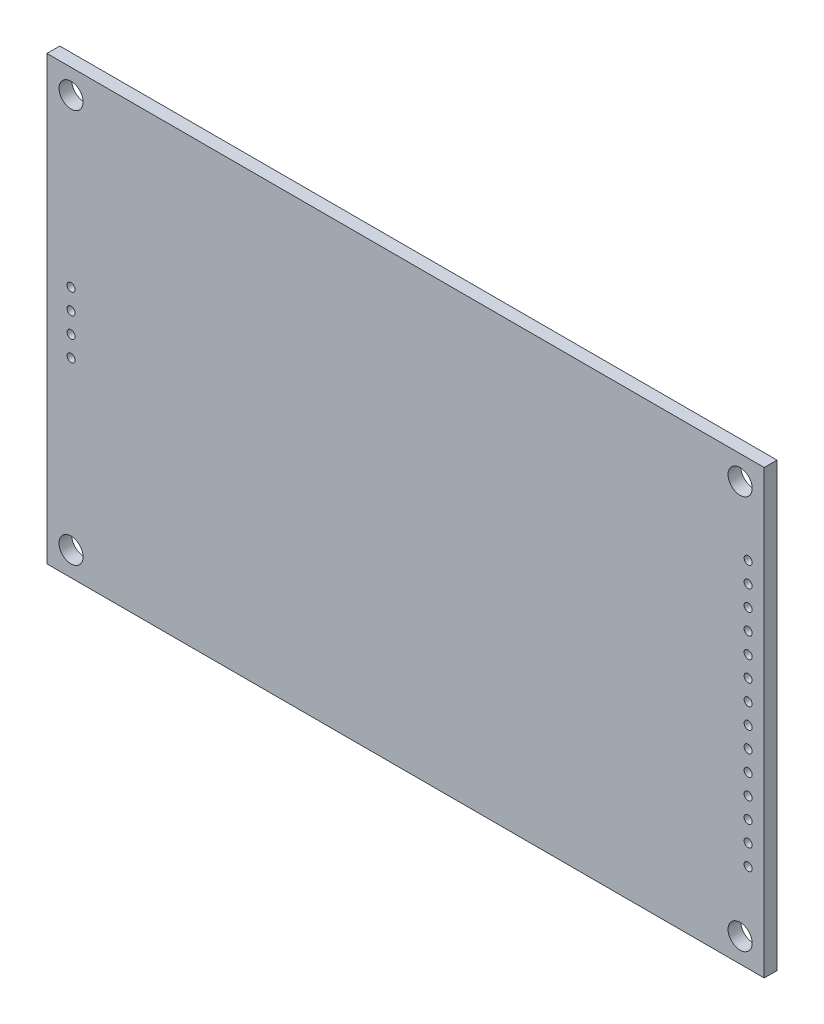
ISO-10303-21;
HEADER;
FILE_DESCRIPTION(('STEP AP214'),'2;1');
FILE_NAME('part.step','',(''),(''),'','','');
FILE_SCHEMA(('AUTOMOTIVE_DESIGN { 1 0 10303 214 1 1 1 1 }'));
ENDSEC;
DATA;
#1=APPLICATION_CONTEXT('core data for automotive mechanical design processes');
#2=APPLICATION_PROTOCOL_DEFINITION('international standard','automotive_design',2000,#1);
#3=PRODUCT_CONTEXT('',#1,'mechanical');
#4=PRODUCT('Part','Part','',(#3));
#5=PRODUCT_RELATED_PRODUCT_CATEGORY('part','',(#4));
#6=PRODUCT_DEFINITION_FORMATION('','',#4);
#7=PRODUCT_DEFINITION_CONTEXT('part definition',#1,'design');
#8=PRODUCT_DEFINITION('design','',#6,#7);
#9=PRODUCT_DEFINITION_SHAPE('','',#8);
#10=(LENGTH_UNIT() NAMED_UNIT(*) SI_UNIT(.MILLI.,.METRE.));
#11=(NAMED_UNIT(*) PLANE_ANGLE_UNIT() SI_UNIT($,.RADIAN.));
#12=(NAMED_UNIT(*) SI_UNIT($,.STERADIAN.) SOLID_ANGLE_UNIT());
#13=UNCERTAINTY_MEASURE_WITH_UNIT(LENGTH_MEASURE(1.E-05),#10,'distance_accuracy_value','');
#14=(GEOMETRIC_REPRESENTATION_CONTEXT(3) GLOBAL_UNCERTAINTY_ASSIGNED_CONTEXT((#13)) GLOBAL_UNIT_ASSIGNED_CONTEXT((#10,
#11,#12)) REPRESENTATION_CONTEXT('',''));
#15=CARTESIAN_POINT('',(0.,0.,0.));
#16=DIRECTION('',(0.,0.,1.));
#17=DIRECTION('',(1.,0.,0.));
#18=AXIS2_PLACEMENT_3D('',#15,#16,#17);
#19=CARTESIAN_POINT('',(-44.3,28.04,1.6));
#20=DIRECTION('',(1.,0.,0.));
#21=DIRECTION('',(0.,1.,0.));
#22=AXIS2_PLACEMENT_3D('',#19,#20,#21);
#23=PLANE('',#22);
#24=DIRECTION('',(0.,-1.,0.));
#25=VECTOR('',#24,1.);
#26=CARTESIAN_POINT('',(-44.3,28.04,0.));
#27=LINE('',#26,#25);
#28=CARTESIAN_POINT('',(-44.3,28.04,0.));
#29=VERTEX_POINT('',#28);
#30=CARTESIAN_POINT('',(-44.3,-27.,0.));
#31=VERTEX_POINT('',#30);
#32=EDGE_CURVE('E111',#29,#31,#27,.T.);
#33=ORIENTED_EDGE('',*,*,#32,.T.);
#34=DIRECTION('',(0.,0.,-1.));
#35=VECTOR('',#34,1.);
#36=CARTESIAN_POINT('',(-44.3,-27.,1.6));
#37=LINE('',#36,#35);
#38=CARTESIAN_POINT('',(-44.3,-27.,1.6));
#39=VERTEX_POINT('',#38);
#40=EDGE_CURVE('E11',#39,#31,#37,.T.);
#41=ORIENTED_EDGE('',*,*,#40,.F.);
#42=DIRECTION('',(0.,-1.,0.));
#43=VECTOR('',#42,1.);
#44=CARTESIAN_POINT('',(-44.3,28.04,1.6));
#45=LINE('',#44,#43);
#46=CARTESIAN_POINT('',(-44.3,28.04,1.6));
#47=VERTEX_POINT('',#46);
#48=EDGE_CURVE('E95',#47,#39,#45,.T.);
#49=ORIENTED_EDGE('',*,*,#48,.F.);
#50=DIRECTION('',(0.,0.,-1.));
#51=VECTOR('',#50,1.);
#52=CARTESIAN_POINT('',(-44.3,28.04,1.6));
#53=LINE('',#52,#51);
#54=EDGE_CURVE('E107',#47,#29,#53,.T.);
#55=ORIENTED_EDGE('',*,*,#54,.T.);
#56=EDGE_LOOP('',(#33,#41,#49,#55));
#57=FACE_BOUND('',#56,.T.);
#58=ADVANCED_FACE('F43',(#57),#23,.F.);
#59=CARTESIAN_POINT('',(-44.3,-27.,1.6));
#60=DIRECTION('',(0.,1.,0.));
#61=DIRECTION('',(0.,0.,1.));
#62=AXIS2_PLACEMENT_3D('',#59,#60,#61);
#63=PLANE('',#62);
#64=DIRECTION('',(1.,0.,0.));
#65=VECTOR('',#64,1.);
#66=CARTESIAN_POINT('',(-44.3,-27.,0.));
#67=LINE('',#66,#65);
#68=CARTESIAN_POINT('',(45.,-27.,0.));
#69=VERTEX_POINT('',#68);
#70=EDGE_CURVE('E100',#31,#69,#67,.T.);
#71=ORIENTED_EDGE('',*,*,#70,.T.);
#72=DIRECTION('',(0.,0.,-1.));
#73=VECTOR('',#72,1.);
#74=CARTESIAN_POINT('',(45.,-27.,1.6));
#75=LINE('',#74,#73);
#76=CARTESIAN_POINT('',(45.,-27.,1.6));
#77=VERTEX_POINT('',#76);
#78=EDGE_CURVE('E52',#77,#69,#75,.T.);
#79=ORIENTED_EDGE('',*,*,#78,.F.);
#80=DIRECTION('',(1.,0.,0.));
#81=VECTOR('',#80,1.);
#82=CARTESIAN_POINT('',(-44.3,-27.,1.6));
#83=LINE('',#82,#81);
#84=EDGE_CURVE('E90',#39,#77,#83,.T.);
#85=ORIENTED_EDGE('',*,*,#84,.F.);
#86=ORIENTED_EDGE('',*,*,#40,.T.);
#87=EDGE_LOOP('',(#71,#79,#85,#86));
#88=FACE_BOUND('',#87,.T.);
#89=ADVANCED_FACE('F99',(#88),#63,.F.);
#90=CARTESIAN_POINT('',(45.,28.04,1.6));
#91=DIRECTION('',(-1.,0.,0.));
#92=DIRECTION('',(0.,0.,1.));
#93=AXIS2_PLACEMENT_3D('',#90,#91,#92);
#94=PLANE('',#93);
#95=DIRECTION('',(0.,1.,0.));
#96=VECTOR('',#95,1.);
#97=CARTESIAN_POINT('',(45.,28.04,0.));
#98=LINE('',#97,#96);
#99=CARTESIAN_POINT('',(45.,28.04,0.));
#100=VERTEX_POINT('',#99);
#101=EDGE_CURVE('E77',#69,#100,#98,.T.);
#102=ORIENTED_EDGE('',*,*,#101,.T.);
#103=DIRECTION('',(0.,0.,-1.));
#104=VECTOR('',#103,1.);
#105=CARTESIAN_POINT('',(45.,28.04,1.6));
#106=LINE('',#105,#104);
#107=CARTESIAN_POINT('',(45.,28.04,1.6));
#108=VERTEX_POINT('',#107);
#109=EDGE_CURVE('E102',#108,#100,#106,.T.);
#110=ORIENTED_EDGE('',*,*,#109,.F.);
#111=DIRECTION('',(0.,1.,0.));
#112=VECTOR('',#111,1.);
#113=CARTESIAN_POINT('',(45.,28.04,1.6));
#114=LINE('',#113,#112);
#115=EDGE_CURVE('E93',#77,#108,#114,.T.);
#116=ORIENTED_EDGE('',*,*,#115,.F.);
#117=ORIENTED_EDGE('',*,*,#78,.T.);
#118=EDGE_LOOP('',(#102,#110,#116,#117));
#119=FACE_BOUND('',#118,.T.);
#120=ADVANCED_FACE('F103',(#119),#94,.F.);
#121=CARTESIAN_POINT('',(-44.3,28.04,1.6));
#122=DIRECTION('',(0.,-1.,0.));
#123=DIRECTION('',(0.,0.,-1.));
#124=AXIS2_PLACEMENT_3D('',#121,#122,#123);
#125=PLANE('',#124);
#126=DIRECTION('',(-1.,0.,0.));
#127=VECTOR('',#126,1.);
#128=CARTESIAN_POINT('',(-44.3,28.04,0.));
#129=LINE('',#128,#127);
#130=EDGE_CURVE('E83',#100,#29,#129,.T.);
#131=ORIENTED_EDGE('',*,*,#130,.T.);
#132=ORIENTED_EDGE('',*,*,#54,.F.);
#133=DIRECTION('',(-1.,0.,0.));
#134=VECTOR('',#133,1.);
#135=CARTESIAN_POINT('',(-44.3,28.04,1.6));
#136=LINE('',#135,#134);
#137=EDGE_CURVE('E60',#108,#47,#136,.T.);
#138=ORIENTED_EDGE('',*,*,#137,.F.);
#139=ORIENTED_EDGE('',*,*,#109,.T.);
#140=EDGE_LOOP('',(#131,#132,#138,#139));
#141=FACE_BOUND('',#140,.T.);
#142=ADVANCED_FACE('F125',(#141),#125,.F.);
#143=CARTESIAN_POINT('',(0.,0.,1.6));
#144=DIRECTION('',(0.,0.,1.));
#145=DIRECTION('',(1.,0.,0.));
#146=AXIS2_PLACEMENT_3D('',#143,#144,#145);
#147=PLANE('',#146);
#148=CARTESIAN_POINT('',(43.,-10.91,1.6));
#149=DIRECTION('',(0.,0.,1.));
#150=DIRECTION('',(1.,0.,0.));
#151=AXIS2_PLACEMENT_3D('',#148,#149,#150);
#152=CIRCLE('',#151,0.499999999999999);
#153=CARTESIAN_POINT('',(43.5,-10.91,1.6));
#154=VERTEX_POINT('',#153);
#155=EDGE_CURVE('E208',#154,#154,#152,.T.);
#156=ORIENTED_EDGE('',*,*,#155,.F.);
#157=EDGE_LOOP('',(#156));
#158=FACE_BOUND('',#157,.T.);
#159=CARTESIAN_POINT('',(43.,-15.99,1.6));
#160=DIRECTION('',(0.,0.,1.));
#161=DIRECTION('',(1.,0.,0.));
#162=AXIS2_PLACEMENT_3D('',#159,#160,#161);
#163=CIRCLE('',#162,0.499999999999999);
#164=CARTESIAN_POINT('',(43.5,-15.99,1.6));
#165=VERTEX_POINT('',#164);
#166=EDGE_CURVE('E217',#165,#165,#163,.T.);
#167=ORIENTED_EDGE('',*,*,#166,.F.);
#168=EDGE_LOOP('',(#167));
#169=FACE_BOUND('',#168,.T.);
#170=CARTESIAN_POINT('',(43.,-8.37,1.6));
#171=DIRECTION('',(0.,0.,1.));
#172=DIRECTION('',(1.,0.,0.));
#173=AXIS2_PLACEMENT_3D('',#170,#171,#172);
#174=CIRCLE('',#173,0.499999999999999);
#175=CARTESIAN_POINT('',(43.5,-8.37,1.6));
#176=VERTEX_POINT('',#175);
#177=EDGE_CURVE('E225',#176,#176,#174,.T.);
#178=ORIENTED_EDGE('',*,*,#177,.F.);
#179=EDGE_LOOP('',(#178));
#180=FACE_BOUND('',#179,.T.);
#181=CARTESIAN_POINT('',(43.,-5.83,1.6));
#182=DIRECTION('',(0.,0.,1.));
#183=DIRECTION('',(1.,0.,0.));
#184=AXIS2_PLACEMENT_3D('',#181,#182,#183);
#185=CIRCLE('',#184,0.499999999999999);
#186=CARTESIAN_POINT('',(43.5,-5.83,1.6));
#187=VERTEX_POINT('',#186);
#188=EDGE_CURVE('E233',#187,#187,#185,.T.);
#189=ORIENTED_EDGE('',*,*,#188,.F.);
#190=EDGE_LOOP('',(#189));
#191=FACE_BOUND('',#190,.T.);
#192=CARTESIAN_POINT('',(43.,-3.29,1.6));
#193=DIRECTION('',(0.,0.,1.));
#194=DIRECTION('',(1.,0.,0.));
#195=AXIS2_PLACEMENT_3D('',#192,#193,#194);
#196=CIRCLE('',#195,0.499999999999999);
#197=CARTESIAN_POINT('',(43.5,-3.29,1.6));
#198=VERTEX_POINT('',#197);
#199=EDGE_CURVE('E241',#198,#198,#196,.T.);
#200=ORIENTED_EDGE('',*,*,#199,.F.);
#201=EDGE_LOOP('',(#200));
#202=FACE_BOUND('',#201,.T.);
#203=CARTESIAN_POINT('',(43.,-0.750000000000003,1.6));
#204=DIRECTION('',(0.,0.,1.));
#205=DIRECTION('',(1.,0.,0.));
#206=AXIS2_PLACEMENT_3D('',#203,#204,#205);
#207=CIRCLE('',#206,0.499999999999999);
#208=CARTESIAN_POINT('',(43.5,-0.750000000000003,1.6));
#209=VERTEX_POINT('',#208);
#210=EDGE_CURVE('E249',#209,#209,#207,.T.);
#211=ORIENTED_EDGE('',*,*,#210,.F.);
#212=EDGE_LOOP('',(#211));
#213=FACE_BOUND('',#212,.T.);
#214=CARTESIAN_POINT('',(43.,1.79,1.6));
#215=DIRECTION('',(0.,0.,1.));
#216=DIRECTION('',(1.,0.,0.));
#217=AXIS2_PLACEMENT_3D('',#214,#215,#216);
#218=CIRCLE('',#217,0.499999999999999);
#219=CARTESIAN_POINT('',(43.5,1.79,1.6));
#220=VERTEX_POINT('',#219);
#221=EDGE_CURVE('E257',#220,#220,#218,.T.);
#222=ORIENTED_EDGE('',*,*,#221,.F.);
#223=EDGE_LOOP('',(#222));
#224=FACE_BOUND('',#223,.T.);
#225=CARTESIAN_POINT('',(43.,4.33,1.6));
#226=DIRECTION('',(0.,0.,1.));
#227=DIRECTION('',(1.,0.,0.));
#228=AXIS2_PLACEMENT_3D('',#225,#226,#227);
#229=CIRCLE('',#228,0.499999999999999);
#230=CARTESIAN_POINT('',(43.5,4.33,1.6));
#231=VERTEX_POINT('',#230);
#232=EDGE_CURVE('E177',#231,#231,#229,.T.);
#233=ORIENTED_EDGE('',*,*,#232,.F.);
#234=EDGE_LOOP('',(#233));
#235=FACE_BOUND('',#234,.T.);
#236=CARTESIAN_POINT('',(43.,17.03,1.6));
#237=DIRECTION('',(0.,0.,1.));
#238=DIRECTION('',(1.,0.,0.));
#239=AXIS2_PLACEMENT_3D('',#236,#237,#238);
#240=CIRCLE('',#239,0.499999999999999);
#241=CARTESIAN_POINT('',(43.5,17.03,1.6));
#242=VERTEX_POINT('',#241);
#243=EDGE_CURVE('E160',#242,#242,#240,.T.);
#244=ORIENTED_EDGE('',*,*,#243,.F.);
#245=EDGE_LOOP('',(#244));
#246=FACE_BOUND('',#245,.T.);
#247=CARTESIAN_POINT('',(42.,-24.,1.6));
#248=DIRECTION('',(0.,0.,1.));
#249=DIRECTION('',(1.,0.,0.));
#250=AXIS2_PLACEMENT_3D('',#247,#248,#249);
#251=CIRCLE('',#250,1.5);
#252=CARTESIAN_POINT('',(43.5,-24.,1.6));
#253=VERTEX_POINT('',#252);
#254=EDGE_CURVE('E145',#253,#253,#251,.T.);
#255=ORIENTED_EDGE('',*,*,#254,.F.);
#256=EDGE_LOOP('',(#255));
#257=FACE_BOUND('',#256,.T.);
#258=CARTESIAN_POINT('',(42.,25.04,1.6));
#259=DIRECTION('',(0.,0.,1.));
#260=DIRECTION('',(1.,0.,0.));
#261=AXIS2_PLACEMENT_3D('',#258,#259,#260);
#262=CIRCLE('',#261,1.5);
#263=CARTESIAN_POINT('',(43.5,25.04,1.6));
#264=VERTEX_POINT('',#263);
#265=EDGE_CURVE('E144',#264,#264,#262,.T.);
#266=ORIENTED_EDGE('',*,*,#265,.F.);
#267=EDGE_LOOP('',(#266));
#268=FACE_BOUND('',#267,.T.);
#269=CARTESIAN_POINT('',(-41.3,-24.,1.6));
#270=DIRECTION('',(0.,0.,1.));
#271=DIRECTION('',(1.,0.,0.));
#272=AXIS2_PLACEMENT_3D('',#269,#270,#271);
#273=CIRCLE('',#272,1.5);
#274=CARTESIAN_POINT('',(-39.8,-24.,1.6));
#275=VERTEX_POINT('',#274);
#276=EDGE_CURVE('E136',#275,#275,#273,.T.);
#277=ORIENTED_EDGE('',*,*,#276,.F.);
#278=EDGE_LOOP('',(#277));
#279=FACE_BOUND('',#278,.T.);
#280=CARTESIAN_POINT('',(43.,14.49,1.6));
#281=DIRECTION('',(0.,0.,1.));
#282=DIRECTION('',(1.,0.,0.));
#283=AXIS2_PLACEMENT_3D('',#280,#281,#282);
#284=CIRCLE('',#283,0.499999999999999);
#285=CARTESIAN_POINT('',(43.5,14.49,1.6));
#286=VERTEX_POINT('',#285);
#287=EDGE_CURVE('E161',#286,#286,#284,.T.);
#288=ORIENTED_EDGE('',*,*,#287,.F.);
#289=EDGE_LOOP('',(#288));
#290=FACE_BOUND('',#289,.T.);
#291=CARTESIAN_POINT('',(43.,11.95,1.6));
#292=DIRECTION('',(0.,0.,1.));
#293=DIRECTION('',(1.,0.,0.));
#294=AXIS2_PLACEMENT_3D('',#291,#292,#293);
#295=CIRCLE('',#294,0.499999999999999);
#296=CARTESIAN_POINT('',(43.5,11.95,1.6));
#297=VERTEX_POINT('',#296);
#298=EDGE_CURVE('E193',#297,#297,#295,.T.);
#299=ORIENTED_EDGE('',*,*,#298,.F.);
#300=EDGE_LOOP('',(#299));
#301=FACE_BOUND('',#300,.T.);
#302=CARTESIAN_POINT('',(43.,9.41,1.6));
#303=DIRECTION('',(0.,0.,1.));
#304=DIRECTION('',(1.,0.,0.));
#305=AXIS2_PLACEMENT_3D('',#302,#303,#304);
#306=CIRCLE('',#305,0.499999999999999);
#307=CARTESIAN_POINT('',(43.5,9.41,1.6));
#308=VERTEX_POINT('',#307);
#309=EDGE_CURVE('E185',#308,#308,#306,.T.);
#310=ORIENTED_EDGE('',*,*,#309,.F.);
#311=EDGE_LOOP('',(#310));
#312=FACE_BOUND('',#311,.T.);
#313=CARTESIAN_POINT('',(43.,6.87,1.6));
#314=DIRECTION('',(0.,0.,1.));
#315=DIRECTION('',(1.,0.,0.));
#316=AXIS2_PLACEMENT_3D('',#313,#314,#315);
#317=CIRCLE('',#316,0.499999999999999);
#318=CARTESIAN_POINT('',(43.5,6.87,1.6));
#319=VERTEX_POINT('',#318);
#320=EDGE_CURVE('E176',#319,#319,#317,.T.);
#321=ORIENTED_EDGE('',*,*,#320,.F.);
#322=EDGE_LOOP('',(#321));
#323=FACE_BOUND('',#322,.T.);
#324=CARTESIAN_POINT('',(-41.3,-3.29,1.6));
#325=DIRECTION('',(0.,0.,1.));
#326=DIRECTION('',(1.,0.,0.));
#327=AXIS2_PLACEMENT_3D('',#324,#325,#326);
#328=CIRCLE('',#327,0.499999999999999);
#329=CARTESIAN_POINT('',(-40.8,-3.29,1.6));
#330=VERTEX_POINT('',#329);
#331=EDGE_CURVE('E289',#330,#330,#328,.T.);
#332=ORIENTED_EDGE('',*,*,#331,.F.);
#333=EDGE_LOOP('',(#332));
#334=FACE_BOUND('',#333,.T.);
#335=CARTESIAN_POINT('',(43.,-13.45,1.6));
#336=DIRECTION('',(0.,0.,1.));
#337=DIRECTION('',(1.,0.,0.));
#338=AXIS2_PLACEMENT_3D('',#335,#336,#337);
#339=CIRCLE('',#338,0.499999999999999);
#340=CARTESIAN_POINT('',(43.5,-13.45,1.6));
#341=VERTEX_POINT('',#340);
#342=EDGE_CURVE('E209',#341,#341,#339,.T.);
#343=ORIENTED_EDGE('',*,*,#342,.F.);
#344=EDGE_LOOP('',(#343));
#345=FACE_BOUND('',#344,.T.);
#346=CARTESIAN_POINT('',(-41.3,4.33,1.6));
#347=DIRECTION('',(0.,0.,1.));
#348=DIRECTION('',(1.,0.,0.));
#349=AXIS2_PLACEMENT_3D('',#346,#347,#348);
#350=CIRCLE('',#349,0.499999999999999);
#351=CARTESIAN_POINT('',(-40.8,4.33,1.6));
#352=VERTEX_POINT('',#351);
#353=EDGE_CURVE('E272',#352,#352,#350,.T.);
#354=ORIENTED_EDGE('',*,*,#353,.F.);
#355=EDGE_LOOP('',(#354));
#356=FACE_BOUND('',#355,.T.);
#357=CARTESIAN_POINT('',(-41.3,1.79,1.6));
#358=DIRECTION('',(0.,0.,1.));
#359=DIRECTION('',(1.,0.,0.));
#360=AXIS2_PLACEMENT_3D('',#357,#358,#359);
#361=CIRCLE('',#360,0.499999999999999);
#362=CARTESIAN_POINT('',(-40.8,1.79,1.6));
#363=VERTEX_POINT('',#362);
#364=EDGE_CURVE('E273',#363,#363,#361,.T.);
#365=ORIENTED_EDGE('',*,*,#364,.F.);
#366=EDGE_LOOP('',(#365));
#367=FACE_BOUND('',#366,.T.);
#368=CARTESIAN_POINT('',(-41.3,-0.750000000000003,1.6));
#369=DIRECTION('',(0.,0.,1.));
#370=DIRECTION('',(1.,0.,0.));
#371=AXIS2_PLACEMENT_3D('',#368,#369,#370);
#372=CIRCLE('',#371,0.499999999999999);
#373=CARTESIAN_POINT('',(-40.8,-0.750000000000003,1.6));
#374=VERTEX_POINT('',#373);
#375=EDGE_CURVE('E288',#374,#374,#372,.T.);
#376=ORIENTED_EDGE('',*,*,#375,.F.);
#377=EDGE_LOOP('',(#376));
#378=FACE_BOUND('',#377,.T.);
#379=CARTESIAN_POINT('',(-41.3,25.04,1.6));
#380=DIRECTION('',(0.,0.,1.));
#381=DIRECTION('',(1.,0.,0.));
#382=AXIS2_PLACEMENT_3D('',#379,#380,#381);
#383=CIRCLE('',#382,1.5);
#384=CARTESIAN_POINT('',(-39.8,25.04,1.6));
#385=VERTEX_POINT('',#384);
#386=EDGE_CURVE('E132',#385,#385,#383,.T.);
#387=ORIENTED_EDGE('',*,*,#386,.F.);
#388=EDGE_LOOP('',(#387));
#389=FACE_BOUND('',#388,.T.);
#390=ORIENTED_EDGE('',*,*,#48,.T.);
#391=ORIENTED_EDGE('',*,*,#84,.T.);
#392=ORIENTED_EDGE('',*,*,#115,.T.);
#393=ORIENTED_EDGE('',*,*,#137,.T.);
#394=EDGE_LOOP('',(#390,#391,#392,#393));
#395=FACE_BOUND('',#394,.T.);
#396=ADVANCED_FACE('F91',(#158,#169,#180,#191,#202,#213,#224,#235,#246,#257,#268,#279,#290,#301,
#312,#323,#334,#345,#356,#367,#378,#389,#395),#147,.T.);
#397=CARTESIAN_POINT('',(0.,0.,0.));
#398=DIRECTION('',(0.,0.,1.));
#399=DIRECTION('',(1.,0.,0.));
#400=AXIS2_PLACEMENT_3D('',#397,#398,#399);
#401=PLANE('',#400);
#402=CARTESIAN_POINT('',(43.,-10.91,0.));
#403=DIRECTION('',(0.,0.,1.));
#404=DIRECTION('',(1.,0.,0.));
#405=AXIS2_PLACEMENT_3D('',#402,#403,#404);
#406=CIRCLE('',#405,0.499999999999999);
#407=CARTESIAN_POINT('',(43.5,-10.91,0.));
#408=VERTEX_POINT('',#407);
#409=EDGE_CURVE('E204',#408,#408,#406,.T.);
#410=ORIENTED_EDGE('',*,*,#409,.T.);
#411=EDGE_LOOP('',(#410));
#412=FACE_BOUND('',#411,.T.);
#413=CARTESIAN_POINT('',(43.,-15.99,0.));
#414=DIRECTION('',(0.,0.,1.));
#415=DIRECTION('',(1.,0.,0.));
#416=AXIS2_PLACEMENT_3D('',#413,#414,#415);
#417=CIRCLE('',#416,0.499999999999999);
#418=CARTESIAN_POINT('',(43.5,-15.99,0.));
#419=VERTEX_POINT('',#418);
#420=EDGE_CURVE('E213',#419,#419,#417,.T.);
#421=ORIENTED_EDGE('',*,*,#420,.T.);
#422=EDGE_LOOP('',(#421));
#423=FACE_BOUND('',#422,.T.);
#424=CARTESIAN_POINT('',(43.,-8.37,0.));
#425=DIRECTION('',(0.,0.,1.));
#426=DIRECTION('',(1.,0.,0.));
#427=AXIS2_PLACEMENT_3D('',#424,#425,#426);
#428=CIRCLE('',#427,0.499999999999999);
#429=CARTESIAN_POINT('',(43.5,-8.37,0.));
#430=VERTEX_POINT('',#429);
#431=EDGE_CURVE('E221',#430,#430,#428,.T.);
#432=ORIENTED_EDGE('',*,*,#431,.T.);
#433=EDGE_LOOP('',(#432));
#434=FACE_BOUND('',#433,.T.);
#435=CARTESIAN_POINT('',(43.,-5.83,0.));
#436=DIRECTION('',(0.,0.,1.));
#437=DIRECTION('',(1.,0.,0.));
#438=AXIS2_PLACEMENT_3D('',#435,#436,#437);
#439=CIRCLE('',#438,0.499999999999999);
#440=CARTESIAN_POINT('',(43.5,-5.83,0.));
#441=VERTEX_POINT('',#440);
#442=EDGE_CURVE('E229',#441,#441,#439,.T.);
#443=ORIENTED_EDGE('',*,*,#442,.T.);
#444=EDGE_LOOP('',(#443));
#445=FACE_BOUND('',#444,.T.);
#446=CARTESIAN_POINT('',(43.,-3.29,0.));
#447=DIRECTION('',(0.,0.,1.));
#448=DIRECTION('',(1.,0.,0.));
#449=AXIS2_PLACEMENT_3D('',#446,#447,#448);
#450=CIRCLE('',#449,0.499999999999999);
#451=CARTESIAN_POINT('',(43.5,-3.29,0.));
#452=VERTEX_POINT('',#451);
#453=EDGE_CURVE('E237',#452,#452,#450,.T.);
#454=ORIENTED_EDGE('',*,*,#453,.T.);
#455=EDGE_LOOP('',(#454));
#456=FACE_BOUND('',#455,.T.);
#457=CARTESIAN_POINT('',(43.,-0.750000000000003,0.));
#458=DIRECTION('',(0.,0.,1.));
#459=DIRECTION('',(1.,0.,0.));
#460=AXIS2_PLACEMENT_3D('',#457,#458,#459);
#461=CIRCLE('',#460,0.499999999999999);
#462=CARTESIAN_POINT('',(43.5,-0.750000000000003,0.));
#463=VERTEX_POINT('',#462);
#464=EDGE_CURVE('E245',#463,#463,#461,.T.);
#465=ORIENTED_EDGE('',*,*,#464,.T.);
#466=EDGE_LOOP('',(#465));
#467=FACE_BOUND('',#466,.T.);
#468=CARTESIAN_POINT('',(43.,1.79,0.));
#469=DIRECTION('',(0.,0.,1.));
#470=DIRECTION('',(1.,0.,0.));
#471=AXIS2_PLACEMENT_3D('',#468,#469,#470);
#472=CIRCLE('',#471,0.499999999999999);
#473=CARTESIAN_POINT('',(43.5,1.79,0.));
#474=VERTEX_POINT('',#473);
#475=EDGE_CURVE('E253',#474,#474,#472,.T.);
#476=ORIENTED_EDGE('',*,*,#475,.T.);
#477=EDGE_LOOP('',(#476));
#478=FACE_BOUND('',#477,.T.);
#479=CARTESIAN_POINT('',(43.,4.33,0.));
#480=DIRECTION('',(0.,0.,1.));
#481=DIRECTION('',(1.,0.,0.));
#482=AXIS2_PLACEMENT_3D('',#479,#480,#481);
#483=CIRCLE('',#482,0.499999999999999);
#484=CARTESIAN_POINT('',(43.5,4.33,0.));
#485=VERTEX_POINT('',#484);
#486=EDGE_CURVE('E261',#485,#485,#483,.T.);
#487=ORIENTED_EDGE('',*,*,#486,.T.);
#488=EDGE_LOOP('',(#487));
#489=FACE_BOUND('',#488,.T.);
#490=CARTESIAN_POINT('',(43.,17.03,0.));
#491=DIRECTION('',(0.,0.,1.));
#492=DIRECTION('',(1.,0.,0.));
#493=AXIS2_PLACEMENT_3D('',#490,#491,#492);
#494=CIRCLE('',#493,0.499999999999999);
#495=CARTESIAN_POINT('',(43.5,17.03,0.));
#496=VERTEX_POINT('',#495);
#497=EDGE_CURVE('E156',#496,#496,#494,.T.);
#498=ORIENTED_EDGE('',*,*,#497,.T.);
#499=EDGE_LOOP('',(#498));
#500=FACE_BOUND('',#499,.T.);
#501=CARTESIAN_POINT('',(42.,-24.,0.));
#502=DIRECTION('',(0.,0.,1.));
#503=DIRECTION('',(1.,0.,0.));
#504=AXIS2_PLACEMENT_3D('',#501,#502,#503);
#505=CIRCLE('',#504,1.5);
#506=CARTESIAN_POINT('',(43.5,-24.,0.));
#507=VERTEX_POINT('',#506);
#508=EDGE_CURVE('E165',#507,#507,#505,.T.);
#509=ORIENTED_EDGE('',*,*,#508,.T.);
#510=EDGE_LOOP('',(#509));
#511=FACE_BOUND('',#510,.T.);
#512=CARTESIAN_POINT('',(42.,25.04,0.));
#513=DIRECTION('',(0.,0.,1.));
#514=DIRECTION('',(1.,0.,0.));
#515=AXIS2_PLACEMENT_3D('',#512,#513,#514);
#516=CIRCLE('',#515,1.5);
#517=CARTESIAN_POINT('',(43.5,25.04,0.));
#518=VERTEX_POINT('',#517);
#519=EDGE_CURVE('E140',#518,#518,#516,.T.);
#520=ORIENTED_EDGE('',*,*,#519,.T.);
#521=EDGE_LOOP('',(#520));
#522=FACE_BOUND('',#521,.T.);
#523=CARTESIAN_POINT('',(-41.3,-24.,0.));
#524=DIRECTION('',(0.,0.,1.));
#525=DIRECTION('',(1.,0.,0.));
#526=AXIS2_PLACEMENT_3D('',#523,#524,#525);
#527=CIRCLE('',#526,1.5);
#528=CARTESIAN_POINT('',(-39.8,-24.,0.));
#529=VERTEX_POINT('',#528);
#530=EDGE_CURVE('E149',#529,#529,#527,.T.);
#531=ORIENTED_EDGE('',*,*,#530,.T.);
#532=EDGE_LOOP('',(#531));
#533=FACE_BOUND('',#532,.T.);
#534=CARTESIAN_POINT('',(43.,14.49,0.));
#535=DIRECTION('',(0.,0.,1.));
#536=DIRECTION('',(1.,0.,0.));
#537=AXIS2_PLACEMENT_3D('',#534,#535,#536);
#538=CIRCLE('',#537,0.499999999999999);
#539=CARTESIAN_POINT('',(43.5,14.49,0.));
#540=VERTEX_POINT('',#539);
#541=EDGE_CURVE('E197',#540,#540,#538,.T.);
#542=ORIENTED_EDGE('',*,*,#541,.T.);
#543=EDGE_LOOP('',(#542));
#544=FACE_BOUND('',#543,.T.);
#545=CARTESIAN_POINT('',(43.,11.95,0.));
#546=DIRECTION('',(0.,0.,1.));
#547=DIRECTION('',(1.,0.,0.));
#548=AXIS2_PLACEMENT_3D('',#545,#546,#547);
#549=CIRCLE('',#548,0.499999999999999);
#550=CARTESIAN_POINT('',(43.5,11.95,0.));
#551=VERTEX_POINT('',#550);
#552=EDGE_CURVE('E189',#551,#551,#549,.T.);
#553=ORIENTED_EDGE('',*,*,#552,.T.);
#554=EDGE_LOOP('',(#553));
#555=FACE_BOUND('',#554,.T.);
#556=CARTESIAN_POINT('',(43.,9.41,0.));
#557=DIRECTION('',(0.,0.,1.));
#558=DIRECTION('',(1.,0.,0.));
#559=AXIS2_PLACEMENT_3D('',#556,#557,#558);
#560=CIRCLE('',#559,0.499999999999999);
#561=CARTESIAN_POINT('',(43.5,9.41,0.));
#562=VERTEX_POINT('',#561);
#563=EDGE_CURVE('E181',#562,#562,#560,.T.);
#564=ORIENTED_EDGE('',*,*,#563,.T.);
#565=EDGE_LOOP('',(#564));
#566=FACE_BOUND('',#565,.T.);
#567=CARTESIAN_POINT('',(43.,6.87,0.));
#568=DIRECTION('',(0.,0.,1.));
#569=DIRECTION('',(1.,0.,0.));
#570=AXIS2_PLACEMENT_3D('',#567,#568,#569);
#571=CIRCLE('',#570,0.499999999999999);
#572=CARTESIAN_POINT('',(43.5,6.87,0.));
#573=VERTEX_POINT('',#572);
#574=EDGE_CURVE('E172',#573,#573,#571,.T.);
#575=ORIENTED_EDGE('',*,*,#574,.T.);
#576=EDGE_LOOP('',(#575));
#577=FACE_BOUND('',#576,.T.);
#578=CARTESIAN_POINT('',(-41.3,-3.29,0.));
#579=DIRECTION('',(0.,0.,1.));
#580=DIRECTION('',(1.,0.,0.));
#581=AXIS2_PLACEMENT_3D('',#578,#579,#580);
#582=CIRCLE('',#581,0.499999999999999);
#583=CARTESIAN_POINT('',(-40.8,-3.29,0.));
#584=VERTEX_POINT('',#583);
#585=EDGE_CURVE('E300',#584,#584,#582,.T.);
#586=ORIENTED_EDGE('',*,*,#585,.T.);
#587=EDGE_LOOP('',(#586));
#588=FACE_BOUND('',#587,.T.);
#589=CARTESIAN_POINT('',(43.,-13.45,0.));
#590=DIRECTION('',(0.,0.,1.));
#591=DIRECTION('',(1.,0.,0.));
#592=AXIS2_PLACEMENT_3D('',#589,#590,#591);
#593=CIRCLE('',#592,0.499999999999999);
#594=CARTESIAN_POINT('',(43.5,-13.45,0.));
#595=VERTEX_POINT('',#594);
#596=EDGE_CURVE('E277',#595,#595,#593,.T.);
#597=ORIENTED_EDGE('',*,*,#596,.T.);
#598=EDGE_LOOP('',(#597));
#599=FACE_BOUND('',#598,.T.);
#600=CARTESIAN_POINT('',(-41.3,4.33,0.));
#601=DIRECTION('',(0.,0.,1.));
#602=DIRECTION('',(1.,0.,0.));
#603=AXIS2_PLACEMENT_3D('',#600,#601,#602);
#604=CIRCLE('',#603,0.499999999999999);
#605=CARTESIAN_POINT('',(-40.8,4.33,0.));
#606=VERTEX_POINT('',#605);
#607=EDGE_CURVE('E268',#606,#606,#604,.T.);
#608=ORIENTED_EDGE('',*,*,#607,.T.);
#609=EDGE_LOOP('',(#608));
#610=FACE_BOUND('',#609,.T.);
#611=CARTESIAN_POINT('',(-41.3,1.79,0.));
#612=DIRECTION('',(0.,0.,1.));
#613=DIRECTION('',(1.,0.,0.));
#614=AXIS2_PLACEMENT_3D('',#611,#612,#613);
#615=CIRCLE('',#614,0.499999999999999);
#616=CARTESIAN_POINT('',(-40.8,1.79,0.));
#617=VERTEX_POINT('',#616);
#618=EDGE_CURVE('E293',#617,#617,#615,.T.);
#619=ORIENTED_EDGE('',*,*,#618,.T.);
#620=EDGE_LOOP('',(#619));
#621=FACE_BOUND('',#620,.T.);
#622=CARTESIAN_POINT('',(-41.3,-0.750000000000003,0.));
#623=DIRECTION('',(0.,0.,1.));
#624=DIRECTION('',(1.,0.,0.));
#625=AXIS2_PLACEMENT_3D('',#622,#623,#624);
#626=CIRCLE('',#625,0.499999999999999);
#627=CARTESIAN_POINT('',(-40.8,-0.750000000000003,0.));
#628=VERTEX_POINT('',#627);
#629=EDGE_CURVE('E284',#628,#628,#626,.T.);
#630=ORIENTED_EDGE('',*,*,#629,.T.);
#631=EDGE_LOOP('',(#630));
#632=FACE_BOUND('',#631,.T.);
#633=CARTESIAN_POINT('',(-41.3,25.04,0.));
#634=DIRECTION('',(0.,0.,1.));
#635=DIRECTION('',(1.,0.,0.));
#636=AXIS2_PLACEMENT_3D('',#633,#634,#635);
#637=CIRCLE('',#636,1.5);
#638=CARTESIAN_POINT('',(-39.8,25.04,0.));
#639=VERTEX_POINT('',#638);
#640=EDGE_CURVE('E115',#639,#639,#637,.T.);
#641=ORIENTED_EDGE('',*,*,#640,.T.);
#642=EDGE_LOOP('',(#641));
#643=FACE_BOUND('',#642,.T.);
#644=ORIENTED_EDGE('',*,*,#32,.F.);
#645=ORIENTED_EDGE('',*,*,#130,.F.);
#646=ORIENTED_EDGE('',*,*,#101,.F.);
#647=ORIENTED_EDGE('',*,*,#70,.F.);
#648=EDGE_LOOP('',(#644,#645,#646,#647));
#649=FACE_BOUND('',#648,.T.);
#650=ADVANCED_FACE('F128',(#412,#423,#434,#445,#456,#467,#478,#489,#500,#511,#522,#533,#544,
#555,#566,#577,#588,#599,#610,#621,#632,#643,#649),#401,.F.);
#651=CARTESIAN_POINT('',(-41.3,25.04,0.));
#652=DIRECTION('',(0.,0.,1.));
#653=DIRECTION('',(1.,0.,0.));
#654=AXIS2_PLACEMENT_3D('',#651,#652,#653);
#655=CYLINDRICAL_SURFACE('',#654,1.5);
#656=ORIENTED_EDGE('',*,*,#640,.F.);
#657=EDGE_LOOP('',(#656));
#658=FACE_BOUND('',#657,.T.);
#659=ORIENTED_EDGE('',*,*,#386,.T.);
#660=EDGE_LOOP('',(#659));
#661=FACE_BOUND('',#660,.T.);
#662=ADVANCED_FACE('F324',(#658,#661),#655,.F.);
#663=CARTESIAN_POINT('',(-41.3,-0.750000000000003,0.));
#664=DIRECTION('',(0.,0.,1.));
#665=DIRECTION('',(1.,0.,0.));
#666=AXIS2_PLACEMENT_3D('',#663,#664,#665);
#667=CYLINDRICAL_SURFACE('',#666,0.499999999999999);
#668=ORIENTED_EDGE('',*,*,#629,.F.);
#669=EDGE_LOOP('',(#668));
#670=FACE_BOUND('',#669,.T.);
#671=ORIENTED_EDGE('',*,*,#375,.T.);
#672=EDGE_LOOP('',(#671));
#673=FACE_BOUND('',#672,.T.);
#674=ADVANCED_FACE('F326',(#670,#673),#667,.F.);
#675=CARTESIAN_POINT('',(-41.3,1.79,0.));
#676=DIRECTION('',(0.,0.,1.));
#677=DIRECTION('',(1.,0.,0.));
#678=AXIS2_PLACEMENT_3D('',#675,#676,#677);
#679=CYLINDRICAL_SURFACE('',#678,0.499999999999999);
#680=ORIENTED_EDGE('',*,*,#618,.F.);
#681=EDGE_LOOP('',(#680));
#682=FACE_BOUND('',#681,.T.);
#683=ORIENTED_EDGE('',*,*,#364,.T.);
#684=EDGE_LOOP('',(#683));
#685=FACE_BOUND('',#684,.T.);
#686=ADVANCED_FACE('F333',(#682,#685),#679,.F.);
#687=CARTESIAN_POINT('',(-41.3,4.33,0.));
#688=DIRECTION('',(0.,0.,1.));
#689=DIRECTION('',(1.,0.,0.));
#690=AXIS2_PLACEMENT_3D('',#687,#688,#689);
#691=CYLINDRICAL_SURFACE('',#690,0.499999999999999);
#692=ORIENTED_EDGE('',*,*,#607,.F.);
#693=EDGE_LOOP('',(#692));
#694=FACE_BOUND('',#693,.T.);
#695=ORIENTED_EDGE('',*,*,#353,.T.);
#696=EDGE_LOOP('',(#695));
#697=FACE_BOUND('',#696,.T.);
#698=ADVANCED_FACE('F384',(#694,#697),#691,.F.);
#699=CARTESIAN_POINT('',(43.,-13.45,0.));
#700=DIRECTION('',(0.,0.,1.));
#701=DIRECTION('',(1.,0.,0.));
#702=AXIS2_PLACEMENT_3D('',#699,#700,#701);
#703=CYLINDRICAL_SURFACE('',#702,0.499999999999999);
#704=ORIENTED_EDGE('',*,*,#596,.F.);
#705=EDGE_LOOP('',(#704));
#706=FACE_BOUND('',#705,.T.);
#707=ORIENTED_EDGE('',*,*,#342,.T.);
#708=EDGE_LOOP('',(#707));
#709=FACE_BOUND('',#708,.T.);
#710=ADVANCED_FACE('F395',(#706,#709),#703,.F.);
#711=CARTESIAN_POINT('',(-41.3,-3.29,0.));
#712=DIRECTION('',(0.,0.,1.));
#713=DIRECTION('',(1.,0.,0.));
#714=AXIS2_PLACEMENT_3D('',#711,#712,#713);
#715=CYLINDRICAL_SURFACE('',#714,0.499999999999999);
#716=ORIENTED_EDGE('',*,*,#585,.F.);
#717=EDGE_LOOP('',(#716));
#718=FACE_BOUND('',#717,.T.);
#719=ORIENTED_EDGE('',*,*,#331,.T.);
#720=EDGE_LOOP('',(#719));
#721=FACE_BOUND('',#720,.T.);
#722=ADVANCED_FACE('F308',(#718,#721),#715,.F.);
#723=CARTESIAN_POINT('',(43.,6.87,0.));
#724=DIRECTION('',(0.,0.,1.));
#725=DIRECTION('',(1.,0.,0.));
#726=AXIS2_PLACEMENT_3D('',#723,#724,#725);
#727=CYLINDRICAL_SURFACE('',#726,0.499999999999999);
#728=ORIENTED_EDGE('',*,*,#574,.F.);
#729=EDGE_LOOP('',(#728));
#730=FACE_BOUND('',#729,.T.);
#731=ORIENTED_EDGE('',*,*,#320,.T.);
#732=EDGE_LOOP('',(#731));
#733=FACE_BOUND('',#732,.T.);
#734=ADVANCED_FACE('F416',(#730,#733),#727,.F.);
#735=CARTESIAN_POINT('',(43.,9.41,0.));
#736=DIRECTION('',(0.,0.,1.));
#737=DIRECTION('',(1.,0.,0.));
#738=AXIS2_PLACEMENT_3D('',#735,#736,#737);
#739=CYLINDRICAL_SURFACE('',#738,0.499999999999999);
#740=ORIENTED_EDGE('',*,*,#563,.F.);
#741=EDGE_LOOP('',(#740));
#742=FACE_BOUND('',#741,.T.);
#743=ORIENTED_EDGE('',*,*,#309,.T.);
#744=EDGE_LOOP('',(#743));
#745=FACE_BOUND('',#744,.T.);
#746=ADVANCED_FACE('F427',(#742,#745),#739,.F.);
#747=CARTESIAN_POINT('',(43.,11.95,0.));
#748=DIRECTION('',(0.,0.,1.));
#749=DIRECTION('',(1.,0.,0.));
#750=AXIS2_PLACEMENT_3D('',#747,#748,#749);
#751=CYLINDRICAL_SURFACE('',#750,0.499999999999999);
#752=ORIENTED_EDGE('',*,*,#552,.F.);
#753=EDGE_LOOP('',(#752));
#754=FACE_BOUND('',#753,.T.);
#755=ORIENTED_EDGE('',*,*,#298,.T.);
#756=EDGE_LOOP('',(#755));
#757=FACE_BOUND('',#756,.T.);
#758=ADVANCED_FACE('F438',(#754,#757),#751,.F.);
#759=CARTESIAN_POINT('',(43.,14.49,0.));
#760=DIRECTION('',(0.,0.,1.));
#761=DIRECTION('',(1.,0.,0.));
#762=AXIS2_PLACEMENT_3D('',#759,#760,#761);
#763=CYLINDRICAL_SURFACE('',#762,0.499999999999999);
#764=ORIENTED_EDGE('',*,*,#541,.F.);
#765=EDGE_LOOP('',(#764));
#766=FACE_BOUND('',#765,.T.);
#767=ORIENTED_EDGE('',*,*,#287,.T.);
#768=EDGE_LOOP('',(#767));
#769=FACE_BOUND('',#768,.T.);
#770=ADVANCED_FACE('F449',(#766,#769),#763,.F.);
#771=CARTESIAN_POINT('',(-41.3,-24.,0.));
#772=DIRECTION('',(0.,0.,1.));
#773=DIRECTION('',(1.,0.,0.));
#774=AXIS2_PLACEMENT_3D('',#771,#772,#773);
#775=CYLINDRICAL_SURFACE('',#774,1.5);
#776=ORIENTED_EDGE('',*,*,#530,.F.);
#777=EDGE_LOOP('',(#776));
#778=FACE_BOUND('',#777,.T.);
#779=ORIENTED_EDGE('',*,*,#276,.T.);
#780=EDGE_LOOP('',(#779));
#781=FACE_BOUND('',#780,.T.);
#782=ADVANCED_FACE('F460',(#778,#781),#775,.F.);
#783=CARTESIAN_POINT('',(42.,25.04,0.));
#784=DIRECTION('',(0.,0.,1.));
#785=DIRECTION('',(1.,0.,0.));
#786=AXIS2_PLACEMENT_3D('',#783,#784,#785);
#787=CYLINDRICAL_SURFACE('',#786,1.5);
#788=ORIENTED_EDGE('',*,*,#519,.F.);
#789=EDGE_LOOP('',(#788));
#790=FACE_BOUND('',#789,.T.);
#791=ORIENTED_EDGE('',*,*,#265,.T.);
#792=EDGE_LOOP('',(#791));
#793=FACE_BOUND('',#792,.T.);
#794=ADVANCED_FACE('F471',(#790,#793),#787,.F.);
#795=CARTESIAN_POINT('',(42.,-24.,0.));
#796=DIRECTION('',(0.,0.,1.));
#797=DIRECTION('',(1.,0.,0.));
#798=AXIS2_PLACEMENT_3D('',#795,#796,#797);
#799=CYLINDRICAL_SURFACE('',#798,1.5);
#800=ORIENTED_EDGE('',*,*,#508,.F.);
#801=EDGE_LOOP('',(#800));
#802=FACE_BOUND('',#801,.T.);
#803=ORIENTED_EDGE('',*,*,#254,.T.);
#804=EDGE_LOOP('',(#803));
#805=FACE_BOUND('',#804,.T.);
#806=ADVANCED_FACE('F482',(#802,#805),#799,.F.);
#807=CARTESIAN_POINT('',(43.,17.03,0.));
#808=DIRECTION('',(0.,0.,1.));
#809=DIRECTION('',(1.,0.,0.));
#810=AXIS2_PLACEMENT_3D('',#807,#808,#809);
#811=CYLINDRICAL_SURFACE('',#810,0.499999999999999);
#812=ORIENTED_EDGE('',*,*,#497,.F.);
#813=EDGE_LOOP('',(#812));
#814=FACE_BOUND('',#813,.T.);
#815=ORIENTED_EDGE('',*,*,#243,.T.);
#816=EDGE_LOOP('',(#815));
#817=FACE_BOUND('',#816,.T.);
#818=ADVANCED_FACE('F492',(#814,#817),#811,.F.);
#819=CARTESIAN_POINT('',(43.,4.33,0.));
#820=DIRECTION('',(0.,0.,1.));
#821=DIRECTION('',(1.,0.,0.));
#822=AXIS2_PLACEMENT_3D('',#819,#820,#821);
#823=CYLINDRICAL_SURFACE('',#822,0.499999999999999);
#824=ORIENTED_EDGE('',*,*,#486,.F.);
#825=EDGE_LOOP('',(#824));
#826=FACE_BOUND('',#825,.T.);
#827=ORIENTED_EDGE('',*,*,#232,.T.);
#828=EDGE_LOOP('',(#827));
#829=FACE_BOUND('',#828,.T.);
#830=ADVANCED_FACE('F503',(#826,#829),#823,.F.);
#831=CARTESIAN_POINT('',(43.,1.79,0.));
#832=DIRECTION('',(0.,0.,1.));
#833=DIRECTION('',(1.,0.,0.));
#834=AXIS2_PLACEMENT_3D('',#831,#832,#833);
#835=CYLINDRICAL_SURFACE('',#834,0.499999999999999);
#836=ORIENTED_EDGE('',*,*,#475,.F.);
#837=EDGE_LOOP('',(#836));
#838=FACE_BOUND('',#837,.T.);
#839=ORIENTED_EDGE('',*,*,#221,.T.);
#840=EDGE_LOOP('',(#839));
#841=FACE_BOUND('',#840,.T.);
#842=ADVANCED_FACE('F514',(#838,#841),#835,.F.);
#843=CARTESIAN_POINT('',(43.,-0.750000000000003,0.));
#844=DIRECTION('',(0.,0.,1.));
#845=DIRECTION('',(1.,0.,0.));
#846=AXIS2_PLACEMENT_3D('',#843,#844,#845);
#847=CYLINDRICAL_SURFACE('',#846,0.499999999999999);
#848=ORIENTED_EDGE('',*,*,#464,.F.);
#849=EDGE_LOOP('',(#848));
#850=FACE_BOUND('',#849,.T.);
#851=ORIENTED_EDGE('',*,*,#210,.T.);
#852=EDGE_LOOP('',(#851));
#853=FACE_BOUND('',#852,.T.);
#854=ADVANCED_FACE('F525',(#850,#853),#847,.F.);
#855=CARTESIAN_POINT('',(43.,-3.29,0.));
#856=DIRECTION('',(0.,0.,1.));
#857=DIRECTION('',(1.,0.,0.));
#858=AXIS2_PLACEMENT_3D('',#855,#856,#857);
#859=CYLINDRICAL_SURFACE('',#858,0.499999999999999);
#860=ORIENTED_EDGE('',*,*,#453,.F.);
#861=EDGE_LOOP('',(#860));
#862=FACE_BOUND('',#861,.T.);
#863=ORIENTED_EDGE('',*,*,#199,.T.);
#864=EDGE_LOOP('',(#863));
#865=FACE_BOUND('',#864,.T.);
#866=ADVANCED_FACE('F536',(#862,#865),#859,.F.);
#867=CARTESIAN_POINT('',(43.,-5.83,0.));
#868=DIRECTION('',(0.,0.,1.));
#869=DIRECTION('',(1.,0.,0.));
#870=AXIS2_PLACEMENT_3D('',#867,#868,#869);
#871=CYLINDRICAL_SURFACE('',#870,0.499999999999999);
#872=ORIENTED_EDGE('',*,*,#442,.F.);
#873=EDGE_LOOP('',(#872));
#874=FACE_BOUND('',#873,.T.);
#875=ORIENTED_EDGE('',*,*,#188,.T.);
#876=EDGE_LOOP('',(#875));
#877=FACE_BOUND('',#876,.T.);
#878=ADVANCED_FACE('F547',(#874,#877),#871,.F.);
#879=CARTESIAN_POINT('',(43.,-8.37,0.));
#880=DIRECTION('',(0.,0.,1.));
#881=DIRECTION('',(1.,0.,0.));
#882=AXIS2_PLACEMENT_3D('',#879,#880,#881);
#883=CYLINDRICAL_SURFACE('',#882,0.499999999999999);
#884=ORIENTED_EDGE('',*,*,#431,.F.);
#885=EDGE_LOOP('',(#884));
#886=FACE_BOUND('',#885,.T.);
#887=ORIENTED_EDGE('',*,*,#177,.T.);
#888=EDGE_LOOP('',(#887));
#889=FACE_BOUND('',#888,.T.);
#890=ADVANCED_FACE('F558',(#886,#889),#883,.F.);
#891=CARTESIAN_POINT('',(43.,-15.99,0.));
#892=DIRECTION('',(0.,0.,1.));
#893=DIRECTION('',(1.,0.,0.));
#894=AXIS2_PLACEMENT_3D('',#891,#892,#893);
#895=CYLINDRICAL_SURFACE('',#894,0.499999999999999);
#896=ORIENTED_EDGE('',*,*,#420,.F.);
#897=EDGE_LOOP('',(#896));
#898=FACE_BOUND('',#897,.T.);
#899=ORIENTED_EDGE('',*,*,#166,.T.);
#900=EDGE_LOOP('',(#899));
#901=FACE_BOUND('',#900,.T.);
#902=ADVANCED_FACE('F569',(#898,#901),#895,.F.);
#903=CARTESIAN_POINT('',(43.,-10.91,0.));
#904=DIRECTION('',(0.,0.,1.));
#905=DIRECTION('',(1.,0.,0.));
#906=AXIS2_PLACEMENT_3D('',#903,#904,#905);
#907=CYLINDRICAL_SURFACE('',#906,0.499999999999999);
#908=ORIENTED_EDGE('',*,*,#409,.F.);
#909=EDGE_LOOP('',(#908));
#910=FACE_BOUND('',#909,.T.);
#911=ORIENTED_EDGE('',*,*,#155,.T.);
#912=EDGE_LOOP('',(#911));
#913=FACE_BOUND('',#912,.T.);
#914=ADVANCED_FACE('F580',(#910,#913),#907,.F.);
#915=CLOSED_SHELL('',(#58,#89,#120,#142,#396,#650,#662,#674,#686,#698,#710,#722,#734,#746,#758,
#770,#782,#794,#806,#818,#830,#842,#854,#866,#878,#890,#902,#914));
#916=MANIFOLD_SOLID_BREP('B2',#915);
#917=ADVANCED_BREP_SHAPE_REPRESENTATION('',(#18,#916),#14);
#918=SHAPE_DEFINITION_REPRESENTATION(#9,#917);
ENDSEC;
END-ISO-10303-21;
